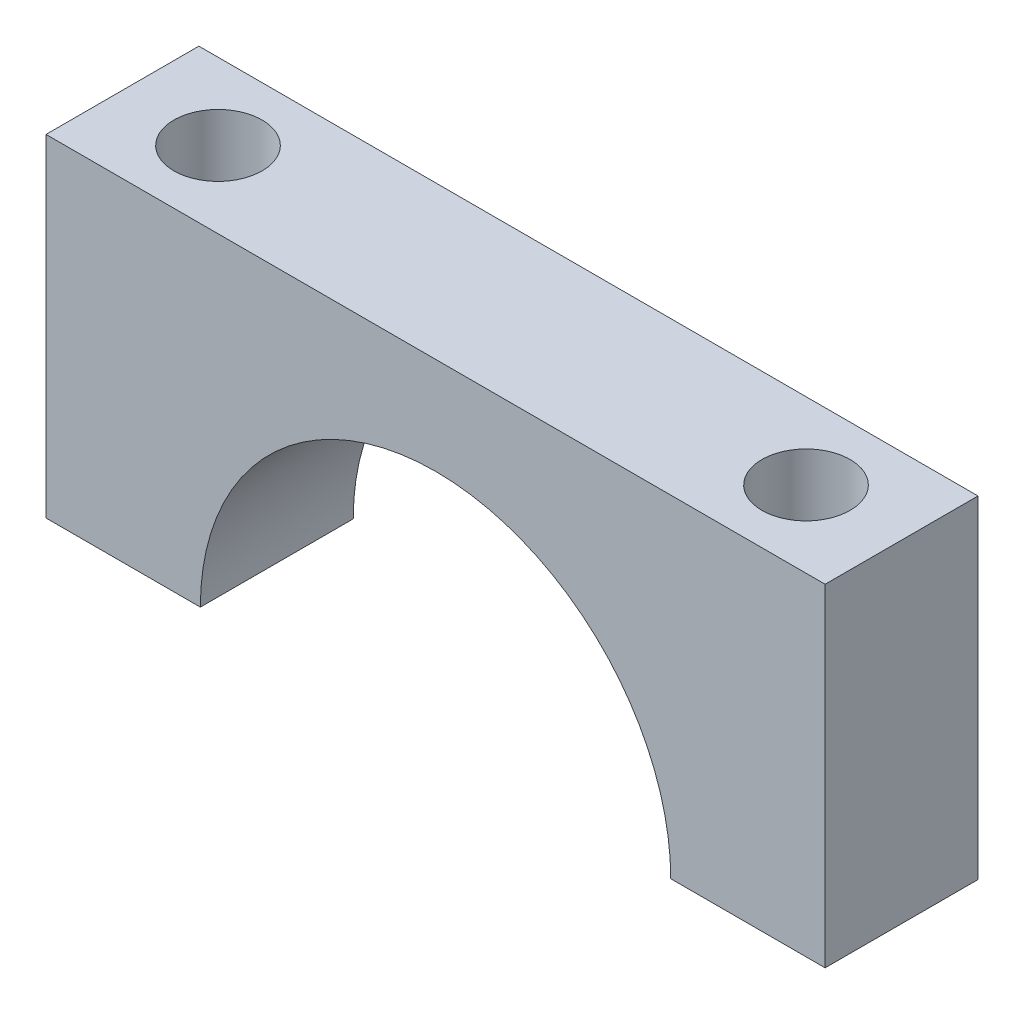
ISO-10303-21;
HEADER;
FILE_DESCRIPTION(('STEP AP214'),'2;1');
FILE_NAME('part.step','',(''),(''),'','','');
FILE_SCHEMA(('AUTOMOTIVE_DESIGN { 1 0 10303 214 1 1 1 1 }'));
ENDSEC;
DATA;
#1=APPLICATION_CONTEXT('core data for automotive mechanical design processes');
#2=APPLICATION_PROTOCOL_DEFINITION('international standard','automotive_design',2000,#1);
#3=PRODUCT_CONTEXT('',#1,'mechanical');
#4=PRODUCT('Part','Part','',(#3));
#5=PRODUCT_RELATED_PRODUCT_CATEGORY('part','',(#4));
#6=PRODUCT_DEFINITION_FORMATION('','',#4);
#7=PRODUCT_DEFINITION_CONTEXT('part definition',#1,'design');
#8=PRODUCT_DEFINITION('design','',#6,#7);
#9=PRODUCT_DEFINITION_SHAPE('','',#8);
#10=(LENGTH_UNIT() NAMED_UNIT(*) SI_UNIT(.MILLI.,.METRE.));
#11=(NAMED_UNIT(*) PLANE_ANGLE_UNIT() SI_UNIT($,.RADIAN.));
#12=(NAMED_UNIT(*) SI_UNIT($,.STERADIAN.) SOLID_ANGLE_UNIT());
#13=UNCERTAINTY_MEASURE_WITH_UNIT(LENGTH_MEASURE(1.E-05),#10,'distance_accuracy_value','');
#14=(GEOMETRIC_REPRESENTATION_CONTEXT(3) GLOBAL_UNCERTAINTY_ASSIGNED_CONTEXT((#13)) GLOBAL_UNIT_ASSIGNED_CONTEXT((#10,
#11,#12)) REPRESENTATION_CONTEXT('',''));
#15=CARTESIAN_POINT('',(0.,0.,0.));
#16=DIRECTION('',(0.,0.,1.));
#17=DIRECTION('',(1.,0.,0.));
#18=AXIS2_PLACEMENT_3D('',#15,#16,#17);
#19=CARTESIAN_POINT('',(0.,0.,2.6));
#20=DIRECTION('',(0.,0.,-1.));
#21=DIRECTION('',(-1.,0.,0.));
#22=AXIS2_PLACEMENT_3D('',#19,#20,#21);
#23=CYLINDRICAL_SURFACE('',#22,8.);
#24=CARTESIAN_POINT('',(0.,0.,-2.6));
#25=DIRECTION('',(0.,0.,-1.));
#26=DIRECTION('',(1.,0.,0.));
#27=AXIS2_PLACEMENT_3D('',#24,#25,#26);
#28=CIRCLE('',#27,8.);
#29=CARTESIAN_POINT('',(-8.,0.,-2.6));
#30=VERTEX_POINT('',#29);
#31=CARTESIAN_POINT('',(8.,0.,-2.6));
#32=VERTEX_POINT('',#31);
#33=EDGE_CURVE('E117',#30,#32,#28,.T.);
#34=ORIENTED_EDGE('',*,*,#33,.T.);
#35=DIRECTION('',(0.,0.,-1.));
#36=VECTOR('',#35,1.);
#37=CARTESIAN_POINT('',(8.,0.,2.6));
#38=LINE('',#37,#36);
#39=CARTESIAN_POINT('',(8.,0.,2.6));
#40=VERTEX_POINT('',#39);
#41=EDGE_CURVE('E11',#40,#32,#38,.T.);
#42=ORIENTED_EDGE('',*,*,#41,.F.);
#43=CARTESIAN_POINT('',(0.,0.,2.6));
#44=DIRECTION('',(0.,0.,-1.));
#45=DIRECTION('',(1.,0.,0.));
#46=AXIS2_PLACEMENT_3D('',#43,#44,#45);
#47=CIRCLE('',#46,8.);
#48=CARTESIAN_POINT('',(-8.,0.,2.6));
#49=VERTEX_POINT('',#48);
#50=EDGE_CURVE('E128',#49,#40,#47,.T.);
#51=ORIENTED_EDGE('',*,*,#50,.F.);
#52=DIRECTION('',(0.,0.,-1.));
#53=VECTOR('',#52,1.);
#54=CARTESIAN_POINT('',(-8.,0.,2.6));
#55=LINE('',#54,#53);
#56=EDGE_CURVE('E113',#49,#30,#55,.T.);
#57=ORIENTED_EDGE('',*,*,#56,.T.);
#58=EDGE_LOOP('',(#34,#42,#51,#57));
#59=FACE_BOUND('',#58,.T.);
#60=ADVANCED_FACE('F33',(#59),#23,.F.);
#61=CARTESIAN_POINT('',(8.,0.,2.6));
#62=DIRECTION('',(0.,1.,0.));
#63=DIRECTION('',(-1.,0.,0.));
#64=AXIS2_PLACEMENT_3D('',#61,#62,#63);
#65=PLANE('',#64);
#66=CARTESIAN_POINT('',(10.,0.,0.));
#67=DIRECTION('',(0.,1.,0.));
#68=DIRECTION('',(0.,0.,1.));
#69=AXIS2_PLACEMENT_3D('',#66,#67,#68);
#70=CIRCLE('',#69,1.5);
#71=CARTESIAN_POINT('',(10.,0.,1.5));
#72=VERTEX_POINT('',#71);
#73=EDGE_CURVE('E177',#72,#72,#70,.T.);
#74=ORIENTED_EDGE('',*,*,#73,.T.);
#75=EDGE_LOOP('',(#74));
#76=FACE_BOUND('',#75,.T.);
#77=DIRECTION('',(1.,0.,0.));
#78=VECTOR('',#77,1.);
#79=CARTESIAN_POINT('',(8.,0.,-2.6));
#80=LINE('',#79,#78);
#81=CARTESIAN_POINT('',(13.25,0.,-2.6));
#82=VERTEX_POINT('',#81);
#83=EDGE_CURVE('E120',#32,#82,#80,.T.);
#84=ORIENTED_EDGE('',*,*,#83,.T.);
#85=DIRECTION('',(0.,0.,-1.));
#86=VECTOR('',#85,1.);
#87=CARTESIAN_POINT('',(13.25,0.,2.6));
#88=LINE('',#87,#86);
#89=CARTESIAN_POINT('',(13.25,0.,2.6));
#90=VERTEX_POINT('',#89);
#91=EDGE_CURVE('E41',#90,#82,#88,.T.);
#92=ORIENTED_EDGE('',*,*,#91,.F.);
#93=DIRECTION('',(1.,0.,0.));
#94=VECTOR('',#93,1.);
#95=CARTESIAN_POINT('',(8.,0.,2.6));
#96=LINE('',#95,#94);
#97=EDGE_CURVE('E86',#40,#90,#96,.T.);
#98=ORIENTED_EDGE('',*,*,#97,.F.);
#99=ORIENTED_EDGE('',*,*,#41,.T.);
#100=EDGE_LOOP('',(#84,#92,#98,#99));
#101=FACE_BOUND('',#100,.T.);
#102=ADVANCED_FACE('F154',(#76,#101),#65,.F.);
#103=CARTESIAN_POINT('',(13.25,0.,2.6));
#104=DIRECTION('',(-1.,0.,0.));
#105=DIRECTION('',(0.,0.,1.));
#106=AXIS2_PLACEMENT_3D('',#103,#104,#105);
#107=PLANE('',#106);
#108=DIRECTION('',(0.,1.,0.));
#109=VECTOR('',#108,1.);
#110=CARTESIAN_POINT('',(13.25,0.,-2.6));
#111=LINE('',#110,#109);
#112=CARTESIAN_POINT('',(13.25,11.3,-2.6));
#113=VERTEX_POINT('',#112);
#114=EDGE_CURVE('E123',#82,#113,#111,.T.);
#115=ORIENTED_EDGE('',*,*,#114,.T.);
#116=DIRECTION('',(0.,0.,-1.));
#117=VECTOR('',#116,1.);
#118=CARTESIAN_POINT('',(13.25,11.3,2.6));
#119=LINE('',#118,#117);
#120=CARTESIAN_POINT('',(13.25,11.3,2.6));
#121=VERTEX_POINT('',#120);
#122=EDGE_CURVE('E108',#121,#113,#119,.T.);
#123=ORIENTED_EDGE('',*,*,#122,.F.);
#124=DIRECTION('',(0.,1.,0.));
#125=VECTOR('',#124,1.);
#126=CARTESIAN_POINT('',(13.25,0.,2.6));
#127=LINE('',#126,#125);
#128=EDGE_CURVE('E99',#90,#121,#127,.T.);
#129=ORIENTED_EDGE('',*,*,#128,.F.);
#130=ORIENTED_EDGE('',*,*,#91,.T.);
#131=EDGE_LOOP('',(#115,#123,#129,#130));
#132=FACE_BOUND('',#131,.T.);
#133=ADVANCED_FACE('F134',(#132),#107,.F.);
#134=CARTESIAN_POINT('',(13.25,11.3,2.6));
#135=DIRECTION('',(0.,-1.,0.));
#136=DIRECTION('',(0.,0.,-1.));
#137=AXIS2_PLACEMENT_3D('',#134,#135,#136);
#138=PLANE('',#137);
#139=CARTESIAN_POINT('',(-10.,11.3,0.));
#140=DIRECTION('',(0.,1.,0.));
#141=DIRECTION('',(0.,0.,1.));
#142=AXIS2_PLACEMENT_3D('',#139,#140,#141);
#143=CIRCLE('',#142,1.5);
#144=CARTESIAN_POINT('',(-10.,11.3,1.5));
#145=VERTEX_POINT('',#144);
#146=EDGE_CURVE('E172',#145,#145,#143,.T.);
#147=ORIENTED_EDGE('',*,*,#146,.F.);
#148=EDGE_LOOP('',(#147));
#149=FACE_BOUND('',#148,.T.);
#150=CARTESIAN_POINT('',(10.,11.3,0.));
#151=DIRECTION('',(0.,1.,0.));
#152=DIRECTION('',(0.,0.,1.));
#153=AXIS2_PLACEMENT_3D('',#150,#151,#152);
#154=CIRCLE('',#153,1.5);
#155=CARTESIAN_POINT('',(10.,11.3,1.5));
#156=VERTEX_POINT('',#155);
#157=EDGE_CURVE('E175',#156,#156,#154,.T.);
#158=ORIENTED_EDGE('',*,*,#157,.F.);
#159=EDGE_LOOP('',(#158));
#160=FACE_BOUND('',#159,.T.);
#161=DIRECTION('',(-1.,0.,0.));
#162=VECTOR('',#161,1.);
#163=CARTESIAN_POINT('',(13.25,11.3,-2.6));
#164=LINE('',#163,#162);
#165=CARTESIAN_POINT('',(-13.25,11.3,-2.6));
#166=VERTEX_POINT('',#165);
#167=EDGE_CURVE('E107',#113,#166,#164,.T.);
#168=ORIENTED_EDGE('',*,*,#167,.T.);
#169=DIRECTION('',(0.,0.,-1.));
#170=VECTOR('',#169,1.);
#171=CARTESIAN_POINT('',(-13.25,11.3,2.6));
#172=LINE('',#171,#170);
#173=CARTESIAN_POINT('',(-13.25,11.3,2.6));
#174=VERTEX_POINT('',#173);
#175=EDGE_CURVE('E104',#174,#166,#172,.T.);
#176=ORIENTED_EDGE('',*,*,#175,.F.);
#177=DIRECTION('',(-1.,0.,0.));
#178=VECTOR('',#177,1.);
#179=CARTESIAN_POINT('',(13.25,11.3,2.6));
#180=LINE('',#179,#178);
#181=EDGE_CURVE('E93',#121,#174,#180,.T.);
#182=ORIENTED_EDGE('',*,*,#181,.F.);
#183=ORIENTED_EDGE('',*,*,#122,.T.);
#184=EDGE_LOOP('',(#168,#176,#182,#183));
#185=FACE_BOUND('',#184,.T.);
#186=ADVANCED_FACE('F105',(#149,#160,#185),#138,.F.);
#187=CARTESIAN_POINT('',(-13.25,11.3,2.6));
#188=DIRECTION('',(1.,0.,0.));
#189=DIRECTION('',(0.,0.,-1.));
#190=AXIS2_PLACEMENT_3D('',#187,#188,#189);
#191=PLANE('',#190);
#192=DIRECTION('',(0.,-1.,0.));
#193=VECTOR('',#192,1.);
#194=CARTESIAN_POINT('',(-13.25,11.3,-2.6));
#195=LINE('',#194,#193);
#196=CARTESIAN_POINT('',(-13.25,0.,-2.6));
#197=VERTEX_POINT('',#196);
#198=EDGE_CURVE('E72',#166,#197,#195,.T.);
#199=ORIENTED_EDGE('',*,*,#198,.T.);
#200=DIRECTION('',(0.,0.,-1.));
#201=VECTOR('',#200,1.);
#202=CARTESIAN_POINT('',(-13.25,0.,2.6));
#203=LINE('',#202,#201);
#204=CARTESIAN_POINT('',(-13.25,0.,2.6));
#205=VERTEX_POINT('',#204);
#206=EDGE_CURVE('E109',#205,#197,#203,.T.);
#207=ORIENTED_EDGE('',*,*,#206,.F.);
#208=DIRECTION('',(0.,-1.,0.));
#209=VECTOR('',#208,1.);
#210=CARTESIAN_POINT('',(-13.25,11.3,2.6));
#211=LINE('',#210,#209);
#212=EDGE_CURVE('E97',#174,#205,#211,.T.);
#213=ORIENTED_EDGE('',*,*,#212,.F.);
#214=ORIENTED_EDGE('',*,*,#175,.T.);
#215=EDGE_LOOP('',(#199,#207,#213,#214));
#216=FACE_BOUND('',#215,.T.);
#217=ADVANCED_FACE('F111',(#216),#191,.F.);
#218=CARTESIAN_POINT('',(-13.25,0.,2.6));
#219=DIRECTION('',(0.,1.,0.));
#220=DIRECTION('',(-1.,0.,0.));
#221=AXIS2_PLACEMENT_3D('',#218,#219,#220);
#222=PLANE('',#221);
#223=CARTESIAN_POINT('',(-10.,0.,0.));
#224=DIRECTION('',(0.,1.,0.));
#225=DIRECTION('',(0.,0.,1.));
#226=AXIS2_PLACEMENT_3D('',#223,#224,#225);
#227=CIRCLE('',#226,1.5);
#228=CARTESIAN_POINT('',(-10.,0.,1.5));
#229=VERTEX_POINT('',#228);
#230=EDGE_CURVE('E121',#229,#229,#227,.T.);
#231=ORIENTED_EDGE('',*,*,#230,.T.);
#232=EDGE_LOOP('',(#231));
#233=FACE_BOUND('',#232,.T.);
#234=DIRECTION('',(1.,0.,0.));
#235=VECTOR('',#234,1.);
#236=CARTESIAN_POINT('',(-13.25,0.,-2.6));
#237=LINE('',#236,#235);
#238=EDGE_CURVE('E78',#197,#30,#237,.T.);
#239=ORIENTED_EDGE('',*,*,#238,.T.);
#240=ORIENTED_EDGE('',*,*,#56,.F.);
#241=DIRECTION('',(1.,0.,0.));
#242=VECTOR('',#241,1.);
#243=CARTESIAN_POINT('',(-13.25,0.,2.6));
#244=LINE('',#243,#242);
#245=EDGE_CURVE('E49',#205,#49,#244,.T.);
#246=ORIENTED_EDGE('',*,*,#245,.F.);
#247=ORIENTED_EDGE('',*,*,#206,.T.);
#248=EDGE_LOOP('',(#239,#240,#246,#247));
#249=FACE_BOUND('',#248,.T.);
#250=ADVANCED_FACE('F141',(#233,#249),#222,.F.);
#251=CARTESIAN_POINT('',(0.,0.,2.6));
#252=DIRECTION('',(0.,0.,1.));
#253=DIRECTION('',(1.,0.,0.));
#254=AXIS2_PLACEMENT_3D('',#251,#252,#253);
#255=PLANE('',#254);
#256=ORIENTED_EDGE('',*,*,#50,.T.);
#257=ORIENTED_EDGE('',*,*,#97,.T.);
#258=ORIENTED_EDGE('',*,*,#128,.T.);
#259=ORIENTED_EDGE('',*,*,#181,.T.);
#260=ORIENTED_EDGE('',*,*,#212,.T.);
#261=ORIENTED_EDGE('',*,*,#245,.T.);
#262=EDGE_LOOP('',(#256,#257,#258,#259,#260,#261));
#263=FACE_BOUND('',#262,.T.);
#264=ADVANCED_FACE('F95',(#263),#255,.T.);
#265=CARTESIAN_POINT('',(0.,0.,-2.6));
#266=DIRECTION('',(0.,0.,1.));
#267=DIRECTION('',(1.,0.,0.));
#268=AXIS2_PLACEMENT_3D('',#265,#266,#267);
#269=PLANE('',#268);
#270=ORIENTED_EDGE('',*,*,#33,.F.);
#271=ORIENTED_EDGE('',*,*,#238,.F.);
#272=ORIENTED_EDGE('',*,*,#198,.F.);
#273=ORIENTED_EDGE('',*,*,#167,.F.);
#274=ORIENTED_EDGE('',*,*,#114,.F.);
#275=ORIENTED_EDGE('',*,*,#83,.F.);
#276=EDGE_LOOP('',(#270,#271,#272,#273,#274,#275));
#277=FACE_BOUND('',#276,.T.);
#278=ADVANCED_FACE('F137',(#277),#269,.F.);
#279=CARTESIAN_POINT('',(-10.,0.,0.));
#280=DIRECTION('',(0.,1.,0.));
#281=DIRECTION('',(0.,0.,1.));
#282=AXIS2_PLACEMENT_3D('',#279,#280,#281);
#283=CYLINDRICAL_SURFACE('',#282,1.5);
#284=ORIENTED_EDGE('',*,*,#230,.F.);
#285=EDGE_LOOP('',(#284));
#286=FACE_BOUND('',#285,.T.);
#287=ORIENTED_EDGE('',*,*,#146,.T.);
#288=EDGE_LOOP('',(#287));
#289=FACE_BOUND('',#288,.T.);
#290=ADVANCED_FACE('F186',(#286,#289),#283,.F.);
#291=CARTESIAN_POINT('',(10.,0.,0.));
#292=DIRECTION('',(0.,1.,0.));
#293=DIRECTION('',(0.,0.,1.));
#294=AXIS2_PLACEMENT_3D('',#291,#292,#293);
#295=CYLINDRICAL_SURFACE('',#294,1.5);
#296=ORIENTED_EDGE('',*,*,#73,.F.);
#297=EDGE_LOOP('',(#296));
#298=FACE_BOUND('',#297,.T.);
#299=ORIENTED_EDGE('',*,*,#157,.T.);
#300=EDGE_LOOP('',(#299));
#301=FACE_BOUND('',#300,.T.);
#302=ADVANCED_FACE('F189',(#298,#301),#295,.F.);
#303=CLOSED_SHELL('',(#60,#102,#133,#186,#217,#250,#264,#278,#290,#302));
#304=MANIFOLD_SOLID_BREP('B2',#303);
#305=ADVANCED_BREP_SHAPE_REPRESENTATION('',(#18,#304),#14);
#306=SHAPE_DEFINITION_REPRESENTATION(#9,#305);
ENDSEC;
END-ISO-10303-21;
